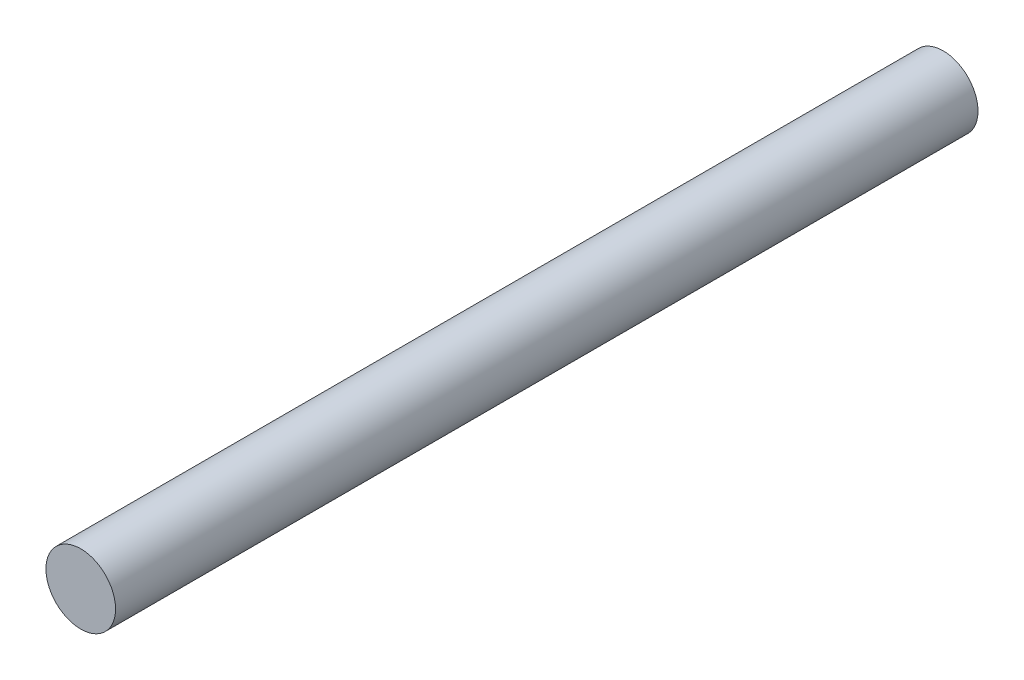
ISO-10303-21;
HEADER;
FILE_DESCRIPTION(('STEP AP214'),'2;1');
FILE_NAME('part.step','',(''),(''),'','','');
FILE_SCHEMA(('AUTOMOTIVE_DESIGN { 1 0 10303 214 1 1 1 1 }'));
ENDSEC;
DATA;
#1=APPLICATION_CONTEXT('core data for automotive mechanical design processes');
#2=APPLICATION_PROTOCOL_DEFINITION('international standard','automotive_design',2000,#1);
#3=PRODUCT_CONTEXT('',#1,'mechanical');
#4=PRODUCT('Part','Part','',(#3));
#5=PRODUCT_RELATED_PRODUCT_CATEGORY('part','',(#4));
#6=PRODUCT_DEFINITION_FORMATION('','',#4);
#7=PRODUCT_DEFINITION_CONTEXT('part definition',#1,'design');
#8=PRODUCT_DEFINITION('design','',#6,#7);
#9=PRODUCT_DEFINITION_SHAPE('','',#8);
#10=(LENGTH_UNIT() NAMED_UNIT(*) SI_UNIT(.MILLI.,.METRE.));
#11=(NAMED_UNIT(*) PLANE_ANGLE_UNIT() SI_UNIT($,.RADIAN.));
#12=(NAMED_UNIT(*) SI_UNIT($,.STERADIAN.) SOLID_ANGLE_UNIT());
#13=UNCERTAINTY_MEASURE_WITH_UNIT(LENGTH_MEASURE(1.E-05),#10,'distance_accuracy_value','');
#14=(GEOMETRIC_REPRESENTATION_CONTEXT(3) GLOBAL_UNCERTAINTY_ASSIGNED_CONTEXT((#13)) GLOBAL_UNIT_ASSIGNED_CONTEXT((#10,
#11,#12)) REPRESENTATION_CONTEXT('',''));
#15=CARTESIAN_POINT('',(0.,0.,0.));
#16=DIRECTION('',(0.,0.,1.));
#17=DIRECTION('',(1.,0.,0.));
#18=AXIS2_PLACEMENT_3D('',#15,#16,#17);
#19=CARTESIAN_POINT('',(0.,0.,280.));
#20=DIRECTION('',(0.,0.,-1.));
#21=DIRECTION('',(-1.,0.,0.));
#22=AXIS2_PLACEMENT_3D('',#19,#20,#21);
#23=CYLINDRICAL_SURFACE('',#22,11.3);
#24=CARTESIAN_POINT('',(0.,0.,280.));
#25=DIRECTION('',(0.,0.,1.));
#26=DIRECTION('',(1.,0.,0.));
#27=AXIS2_PLACEMENT_3D('',#24,#25,#26);
#28=CIRCLE('',#27,11.3);
#29=CARTESIAN_POINT('',(11.3,0.,280.));
#30=VERTEX_POINT('',#29);
#31=EDGE_CURVE('E10',#30,#30,#28,.T.);
#32=ORIENTED_EDGE('',*,*,#31,.F.);
#33=EDGE_LOOP('',(#32));
#34=FACE_BOUND('',#33,.T.);
#35=CARTESIAN_POINT('',(0.,0.,0.));
#36=DIRECTION('',(0.,0.,1.));
#37=DIRECTION('',(1.,0.,0.));
#38=AXIS2_PLACEMENT_3D('',#35,#36,#37);
#39=CIRCLE('',#38,11.3);
#40=CARTESIAN_POINT('',(11.3,0.,0.));
#41=VERTEX_POINT('',#40);
#42=EDGE_CURVE('E37',#41,#41,#39,.T.);
#43=ORIENTED_EDGE('',*,*,#42,.T.);
#44=EDGE_LOOP('',(#43));
#45=FACE_BOUND('',#44,.T.);
#46=ADVANCED_FACE('F34',(#34,#45),#23,.T.);
#47=CARTESIAN_POINT('',(0.,0.,280.));
#48=DIRECTION('',(0.,0.,1.));
#49=DIRECTION('',(1.,0.,0.));
#50=AXIS2_PLACEMENT_3D('',#47,#48,#49);
#51=PLANE('',#50);
#52=ORIENTED_EDGE('',*,*,#31,.T.);
#53=EDGE_LOOP('',(#52));
#54=FACE_BOUND('',#53,.T.);
#55=ADVANCED_FACE('F49',(#54),#51,.T.);
#56=CARTESIAN_POINT('',(0.,0.,0.));
#57=DIRECTION('',(0.,0.,1.));
#58=DIRECTION('',(1.,0.,0.));
#59=AXIS2_PLACEMENT_3D('',#56,#57,#58);
#60=PLANE('',#59);
#61=ORIENTED_EDGE('',*,*,#42,.F.);
#62=EDGE_LOOP('',(#61));
#63=FACE_BOUND('',#62,.T.);
#64=ADVANCED_FACE('F47',(#63),#60,.F.);
#65=CLOSED_SHELL('',(#46,#55,#64));
#66=MANIFOLD_SOLID_BREP('B2',#65);
#67=ADVANCED_BREP_SHAPE_REPRESENTATION('',(#18,#66),#14);
#68=SHAPE_DEFINITION_REPRESENTATION(#9,#67);
ENDSEC;
END-ISO-10303-21;
